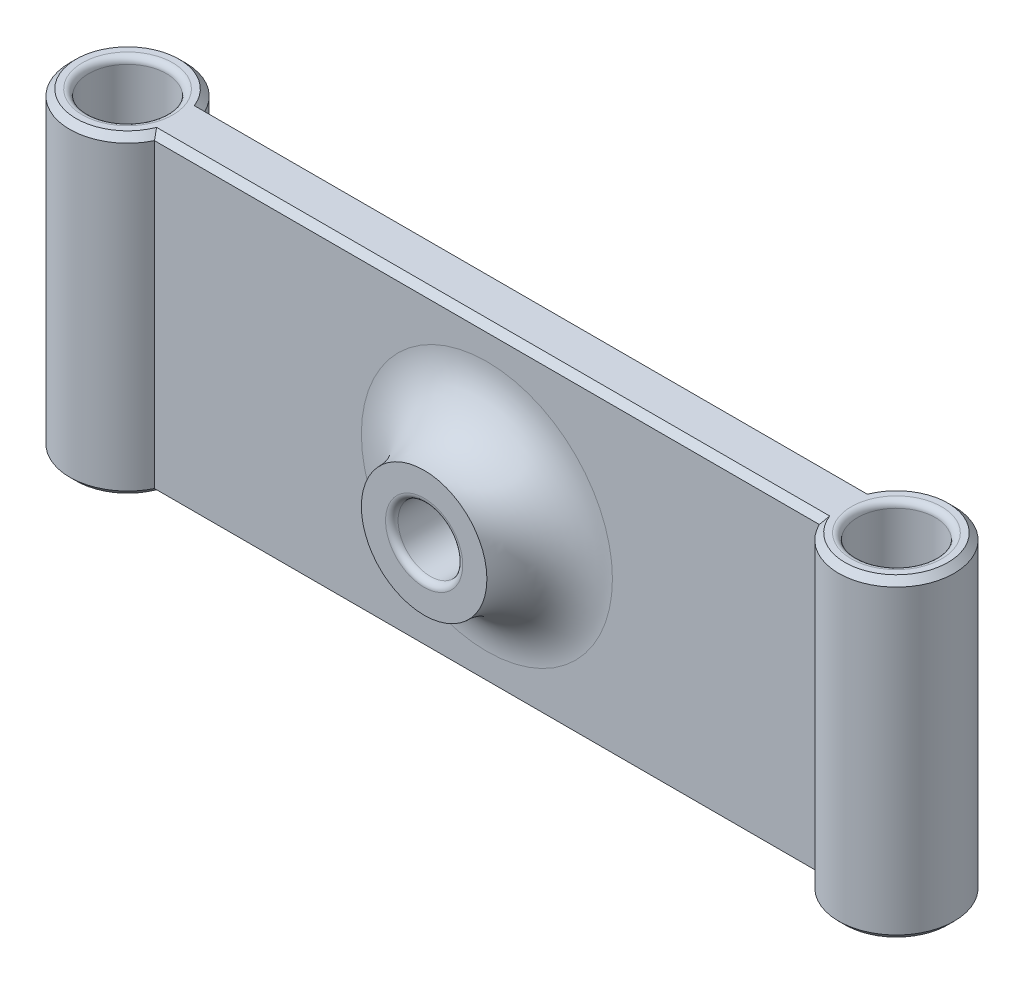
ISO-10303-21;
HEADER;
FILE_DESCRIPTION(('STEP AP214'),'2;1');
FILE_NAME('part.step','',(''),(''),'','','');
FILE_SCHEMA(('AUTOMOTIVE_DESIGN { 1 0 10303 214 1 1 1 1 }'));
ENDSEC;
DATA;
#1=APPLICATION_CONTEXT('core data for automotive mechanical design processes');
#2=APPLICATION_PROTOCOL_DEFINITION('international standard','automotive_design',2000,#1);
#3=PRODUCT_CONTEXT('',#1,'mechanical');
#4=PRODUCT('Part','Part','',(#3));
#5=PRODUCT_RELATED_PRODUCT_CATEGORY('part','',(#4));
#6=PRODUCT_DEFINITION_FORMATION('','',#4);
#7=PRODUCT_DEFINITION_CONTEXT('part definition',#1,'design');
#8=PRODUCT_DEFINITION('design','',#6,#7);
#9=PRODUCT_DEFINITION_SHAPE('','',#8);
#10=(LENGTH_UNIT() NAMED_UNIT(*) SI_UNIT(.MILLI.,.METRE.));
#11=(NAMED_UNIT(*) PLANE_ANGLE_UNIT() SI_UNIT($,.RADIAN.));
#12=(NAMED_UNIT(*) SI_UNIT($,.STERADIAN.) SOLID_ANGLE_UNIT());
#13=UNCERTAINTY_MEASURE_WITH_UNIT(LENGTH_MEASURE(1.E-05),#10,'distance_accuracy_value','');
#14=(GEOMETRIC_REPRESENTATION_CONTEXT(3) GLOBAL_UNCERTAINTY_ASSIGNED_CONTEXT((#13)) GLOBAL_UNIT_ASSIGNED_CONTEXT((#10,
#11,#12)) REPRESENTATION_CONTEXT('',''));
#15=CARTESIAN_POINT('',(0.,0.,0.));
#16=DIRECTION('',(0.,0.,1.));
#17=DIRECTION('',(1.,0.,0.));
#18=AXIS2_PLACEMENT_3D('',#15,#16,#17);
#19=CARTESIAN_POINT('',(-61.25,50.,0.));
#20=DIRECTION('',(0.,1.,0.));
#21=DIRECTION('',(0.,0.,1.));
#22=AXIS2_PLACEMENT_3D('',#19,#20,#21);
#23=PLANE('',#22);
#24=CARTESIAN_POINT('',(61.25,50.,0.));
#25=DIRECTION('',(0.,1.,0.));
#26=DIRECTION('',(0.,0.,1.));
#27=AXIS2_PLACEMENT_3D('',#24,#25,#26);
#28=CIRCLE('',#27,8.19999999999995);
#29=CARTESIAN_POINT('',(53.6184863886645,50.,2.99999999999994));
#30=VERTEX_POINT('',#29);
#31=CARTESIAN_POINT('',(53.6184863886645,50.,-2.99999999999994));
#32=VERTEX_POINT('',#31);
#33=EDGE_CURVE('E126',#30,#32,#28,.T.);
#34=ORIENTED_EDGE('',*,*,#33,.T.);
#35=DIRECTION('',(-1.,0.,0.));
#36=VECTOR('',#35,1.);
#37=CARTESIAN_POINT('',(-52.9650739291168,50.,-2.99999999999993));
#38=LINE('',#37,#36);
#39=CARTESIAN_POINT('',(-53.6184863886645,50.,-2.99999999999993));
#40=VERTEX_POINT('',#39);
#41=EDGE_CURVE('E107',#32,#40,#38,.T.);
#42=ORIENTED_EDGE('',*,*,#41,.T.);
#43=CARTESIAN_POINT('',(-61.25,50.,0.));
#44=DIRECTION('',(0.,1.,0.));
#45=DIRECTION('',(0.,0.,1.));
#46=AXIS2_PLACEMENT_3D('',#43,#44,#45);
#47=CIRCLE('',#46,8.19999999999995);
#48=CARTESIAN_POINT('',(-53.6184863886645,50.,2.99999999999996));
#49=VERTEX_POINT('',#48);
#50=EDGE_CURVE('E115',#40,#49,#47,.T.);
#51=ORIENTED_EDGE('',*,*,#50,.T.);
#52=DIRECTION('',(1.,0.,0.));
#53=VECTOR('',#52,1.);
#54=CARTESIAN_POINT('',(52.9650739291168,50.,2.99999999999994));
#55=LINE('',#54,#53);
#56=EDGE_CURVE('E121',#49,#30,#55,.T.);
#57=ORIENTED_EDGE('',*,*,#56,.T.);
#58=EDGE_LOOP('',(#34,#42,#51,#57));
#59=FACE_BOUND('',#58,.T.);
#60=CARTESIAN_POINT('',(61.25,50.,0.));
#61=DIRECTION('',(0.,1.,0.));
#62=DIRECTION('',(0.,0.,1.));
#63=AXIS2_PLACEMENT_3D('',#60,#61,#62);
#64=CIRCLE('',#63,7.2);
#65=CARTESIAN_POINT('',(61.25,50.,7.19999999999998));
#66=VERTEX_POINT('',#65);
#67=EDGE_CURVE('E291',#66,#66,#64,.F.);
#68=ORIENTED_EDGE('',*,*,#67,.T.);
#69=EDGE_LOOP('',(#68));
#70=FACE_BOUND('',#69,.T.);
#71=CARTESIAN_POINT('',(-61.25,50.,0.));
#72=DIRECTION('',(0.,1.,0.));
#73=DIRECTION('',(0.,0.,1.));
#74=AXIS2_PLACEMENT_3D('',#71,#72,#73);
#75=CIRCLE('',#74,7.2);
#76=CARTESIAN_POINT('',(-61.25,50.,7.2));
#77=VERTEX_POINT('',#76);
#78=EDGE_CURVE('E346',#77,#77,#75,.F.);
#79=ORIENTED_EDGE('',*,*,#78,.T.);
#80=EDGE_LOOP('',(#79));
#81=FACE_BOUND('',#80,.T.);
#82=ADVANCED_FACE('F33',(#59,#70,#81),#23,.T.);
#83=CARTESIAN_POINT('',(-61.25,0.,0.));
#84=DIRECTION('',(0.,1.,0.));
#85=DIRECTION('',(0.,0.,1.));
#86=AXIS2_PLACEMENT_3D('',#83,#84,#85);
#87=PLANE('',#86);
#88=CARTESIAN_POINT('',(61.25,0.,0.));
#89=DIRECTION('',(0.,1.,0.));
#90=DIRECTION('',(0.,0.,1.));
#91=AXIS2_PLACEMENT_3D('',#88,#89,#90);
#92=CIRCLE('',#91,8.19999999999995);
#93=CARTESIAN_POINT('',(53.6184863886645,0.,-2.99999999999994));
#94=VERTEX_POINT('',#93);
#95=CARTESIAN_POINT('',(53.6184863886645,0.,2.99999999999994));
#96=VERTEX_POINT('',#95);
#97=EDGE_CURVE('E46',#94,#96,#92,.F.);
#98=ORIENTED_EDGE('',*,*,#97,.T.);
#99=DIRECTION('',(-1.,0.,0.));
#100=VECTOR('',#99,1.);
#101=CARTESIAN_POINT('',(-61.25,0.,2.99999999999996));
#102=LINE('',#101,#100);
#103=CARTESIAN_POINT('',(-53.6184863886645,0.,2.99999999999996));
#104=VERTEX_POINT('',#103);
#105=EDGE_CURVE('E11',#96,#104,#102,.T.);
#106=ORIENTED_EDGE('',*,*,#105,.T.);
#107=CARTESIAN_POINT('',(-61.25,0.,0.));
#108=DIRECTION('',(0.,1.,0.));
#109=DIRECTION('',(0.,0.,1.));
#110=AXIS2_PLACEMENT_3D('',#107,#108,#109);
#111=CIRCLE('',#110,8.19999999999995);
#112=CARTESIAN_POINT('',(-53.6184863886645,0.,-2.99999999999993));
#113=VERTEX_POINT('',#112);
#114=EDGE_CURVE('E148',#104,#113,#111,.F.);
#115=ORIENTED_EDGE('',*,*,#114,.T.);
#116=DIRECTION('',(1.,0.,0.));
#117=VECTOR('',#116,1.);
#118=CARTESIAN_POINT('',(-61.25,0.,-2.99999999999993));
#119=LINE('',#118,#117);
#120=EDGE_CURVE('E57',#113,#94,#119,.T.);
#121=ORIENTED_EDGE('',*,*,#120,.T.);
#122=EDGE_LOOP('',(#98,#106,#115,#121));
#123=FACE_BOUND('',#122,.T.);
#124=CARTESIAN_POINT('',(-61.25,0.,0.));
#125=DIRECTION('',(0.,1.,0.));
#126=DIRECTION('',(0.,0.,1.));
#127=AXIS2_PLACEMENT_3D('',#124,#125,#126);
#128=CIRCLE('',#127,7.2);
#129=CARTESIAN_POINT('',(-61.25,0.,7.2));
#130=VERTEX_POINT('',#129);
#131=EDGE_CURVE('E331',#130,#130,#128,.T.);
#132=ORIENTED_EDGE('',*,*,#131,.T.);
#133=EDGE_LOOP('',(#132));
#134=FACE_BOUND('',#133,.T.);
#135=CARTESIAN_POINT('',(61.25,0.,0.));
#136=DIRECTION('',(0.,1.,0.));
#137=DIRECTION('',(0.,0.,1.));
#138=AXIS2_PLACEMENT_3D('',#135,#136,#137);
#139=CIRCLE('',#138,7.2);
#140=CARTESIAN_POINT('',(61.25,0.,7.19999999999998));
#141=VERTEX_POINT('',#140);
#142=EDGE_CURVE('E328',#141,#141,#139,.T.);
#143=ORIENTED_EDGE('',*,*,#142,.T.);
#144=EDGE_LOOP('',(#143));
#145=FACE_BOUND('',#144,.T.);
#146=ADVANCED_FACE('F220',(#123,#134,#145),#87,.F.);
#147=CARTESIAN_POINT('',(-61.25,50.,0.));
#148=DIRECTION('',(0.,-1.,0.));
#149=DIRECTION('',(0.,0.,-1.));
#150=AXIS2_PLACEMENT_3D('',#147,#148,#149);
#151=CYLINDRICAL_SURFACE('',#150,9.2);
#152=DIRECTION('',(0.,-1.,0.));
#153=VECTOR('',#152,1.);
#154=CARTESIAN_POINT('',(-52.9650739291168,50.,4.));
#155=LINE('',#154,#153);
#156=CARTESIAN_POINT('',(-52.9650739291168,49.,4.));
#157=VERTEX_POINT('',#156);
#158=CARTESIAN_POINT('',(-52.9650739291168,1.00000000000002,4.));
#159=VERTEX_POINT('',#158);
#160=EDGE_CURVE('E314',#157,#159,#155,.T.);
#161=ORIENTED_EDGE('',*,*,#160,.F.);
#162=CARTESIAN_POINT('',(-61.25,49.,0.));
#163=DIRECTION('',(0.,1.,0.));
#164=DIRECTION('',(0.,0.,1.));
#165=AXIS2_PLACEMENT_3D('',#162,#163,#164);
#166=CIRCLE('',#165,9.2);
#167=CARTESIAN_POINT('',(-52.9650739291168,49.,-3.99999999999997));
#168=VERTEX_POINT('',#167);
#169=EDGE_CURVE('E146',#157,#168,#166,.F.);
#170=ORIENTED_EDGE('',*,*,#169,.T.);
#171=DIRECTION('',(0.,-1.,0.));
#172=VECTOR('',#171,1.);
#173=CARTESIAN_POINT('',(-52.9650739291168,50.,-3.99999999999997));
#174=LINE('',#173,#172);
#175=CARTESIAN_POINT('',(-52.9650739291168,1.00000000000002,-3.99999999999997));
#176=VERTEX_POINT('',#175);
#177=EDGE_CURVE('E310',#168,#176,#174,.T.);
#178=ORIENTED_EDGE('',*,*,#177,.T.);
#179=CARTESIAN_POINT('',(-61.25,1.00000000000002,0.));
#180=DIRECTION('',(0.,1.,0.));
#181=DIRECTION('',(0.,0.,1.));
#182=AXIS2_PLACEMENT_3D('',#179,#180,#181);
#183=CIRCLE('',#182,9.2);
#184=EDGE_CURVE('E144',#176,#159,#183,.T.);
#185=ORIENTED_EDGE('',*,*,#184,.T.);
#186=EDGE_LOOP('',(#161,#170,#178,#185));
#187=FACE_BOUND('',#186,.T.);
#188=ADVANCED_FACE('F225',(#187),#151,.T.);
#189=CARTESIAN_POINT('',(-52.9650739291168,50.,4.));
#190=DIRECTION('',(0.,0.,-1.));
#191=DIRECTION('',(-1.,0.,0.));
#192=AXIS2_PLACEMENT_3D('',#189,#190,#191);
#193=PLANE('',#192);
#194=CARTESIAN_POINT('',(0.,25.,3.99999999999999));
#195=DIRECTION('',(0.,0.,-1.));
#196=DIRECTION('',(-1.,0.,0.));
#197=AXIS2_PLACEMENT_3D('',#194,#195,#196);
#198=CIRCLE('',#197,20.);
#199=CARTESIAN_POINT('',(-20.,25.,4.));
#200=VERTEX_POINT('',#199);
#201=EDGE_CURVE('E325',#200,#200,#198,.T.);
#202=ORIENTED_EDGE('',*,*,#201,.T.);
#203=EDGE_LOOP('',(#202));
#204=FACE_BOUND('',#203,.T.);
#205=DIRECTION('',(0.,-1.,0.));
#206=VECTOR('',#205,1.);
#207=CARTESIAN_POINT('',(52.9650739291168,50.,3.99999999999999));
#208=LINE('',#207,#206);
#209=CARTESIAN_POINT('',(52.9650739291168,49.,3.99999999999999));
#210=VERTEX_POINT('',#209);
#211=CARTESIAN_POINT('',(52.9650739291168,1.00000000000002,3.99999999999999));
#212=VERTEX_POINT('',#211);
#213=EDGE_CURVE('E312',#210,#212,#208,.T.);
#214=ORIENTED_EDGE('',*,*,#213,.F.);
#215=DIRECTION('',(-1.,0.,0.));
#216=VECTOR('',#215,1.);
#217=CARTESIAN_POINT('',(-52.9650739291168,49.,4.));
#218=LINE('',#217,#216);
#219=EDGE_CURVE('E142',#210,#157,#218,.T.);
#220=ORIENTED_EDGE('',*,*,#219,.T.);
#221=ORIENTED_EDGE('',*,*,#160,.T.);
#222=DIRECTION('',(1.,0.,0.));
#223=VECTOR('',#222,1.);
#224=CARTESIAN_POINT('',(-52.9650739291168,1.00000000000002,4.));
#225=LINE('',#224,#223);
#226=EDGE_CURVE('E139',#159,#212,#225,.T.);
#227=ORIENTED_EDGE('',*,*,#226,.T.);
#228=EDGE_LOOP('',(#214,#220,#221,#227));
#229=FACE_BOUND('',#228,.T.);
#230=ADVANCED_FACE('F238',(#204,#229),#193,.F.);
#231=CARTESIAN_POINT('',(61.25,50.,0.));
#232=DIRECTION('',(0.,-1.,0.));
#233=DIRECTION('',(0.,0.,-1.));
#234=AXIS2_PLACEMENT_3D('',#231,#232,#233);
#235=CYLINDRICAL_SURFACE('',#234,9.2);
#236=DIRECTION('',(0.,-1.,0.));
#237=VECTOR('',#236,1.);
#238=CARTESIAN_POINT('',(52.9650739291168,50.,-3.99999999999999));
#239=LINE('',#238,#237);
#240=CARTESIAN_POINT('',(52.9650739291168,49.,-3.99999999999999));
#241=VERTEX_POINT('',#240);
#242=CARTESIAN_POINT('',(52.9650739291168,1.00000000000002,-3.99999999999999));
#243=VERTEX_POINT('',#242);
#244=EDGE_CURVE('E307',#241,#243,#239,.T.);
#245=ORIENTED_EDGE('',*,*,#244,.F.);
#246=CARTESIAN_POINT('',(61.25,49.,0.));
#247=DIRECTION('',(0.,1.,0.));
#248=DIRECTION('',(0.,0.,1.));
#249=AXIS2_PLACEMENT_3D('',#246,#247,#248);
#250=CIRCLE('',#249,9.2);
#251=EDGE_CURVE('E137',#241,#210,#250,.F.);
#252=ORIENTED_EDGE('',*,*,#251,.T.);
#253=ORIENTED_EDGE('',*,*,#213,.T.);
#254=CARTESIAN_POINT('',(61.25,1.00000000000002,0.));
#255=DIRECTION('',(0.,1.,0.));
#256=DIRECTION('',(0.,0.,1.));
#257=AXIS2_PLACEMENT_3D('',#254,#255,#256);
#258=CIRCLE('',#257,9.2);
#259=EDGE_CURVE('E135',#212,#243,#258,.T.);
#260=ORIENTED_EDGE('',*,*,#259,.T.);
#261=EDGE_LOOP('',(#245,#252,#253,#260));
#262=FACE_BOUND('',#261,.T.);
#263=ADVANCED_FACE('F234',(#262),#235,.T.);
#264=CARTESIAN_POINT('',(-52.9650739291168,50.,-3.99999999999997));
#265=DIRECTION('',(0.,0.,1.));
#266=DIRECTION('',(1.,0.,0.));
#267=AXIS2_PLACEMENT_3D('',#264,#265,#266);
#268=PLANE('',#267);
#269=CARTESIAN_POINT('',(0.,25.,-3.99999999999998));
#270=DIRECTION('',(0.,0.,1.));
#271=DIRECTION('',(1.,0.,0.));
#272=AXIS2_PLACEMENT_3D('',#269,#270,#271);
#273=CIRCLE('',#272,19.5393920141695);
#274=CARTESIAN_POINT('',(19.5393920141695,25.,-3.99999999999998));
#275=VERTEX_POINT('',#274);
#276=EDGE_CURVE('E322',#275,#275,#273,.T.);
#277=ORIENTED_EDGE('',*,*,#276,.T.);
#278=EDGE_LOOP('',(#277));
#279=FACE_BOUND('',#278,.T.);
#280=ORIENTED_EDGE('',*,*,#177,.F.);
#281=DIRECTION('',(1.,0.,0.));
#282=VECTOR('',#281,1.);
#283=CARTESIAN_POINT('',(52.9650739291168,49.,-3.99999999999999));
#284=LINE('',#283,#282);
#285=EDGE_CURVE('E109',#168,#241,#284,.T.);
#286=ORIENTED_EDGE('',*,*,#285,.T.);
#287=ORIENTED_EDGE('',*,*,#244,.T.);
#288=DIRECTION('',(-1.,0.,0.));
#289=VECTOR('',#288,1.);
#290=CARTESIAN_POINT('',(-52.9650739291168,1.00000000000002,-3.99999999999997));
#291=LINE('',#290,#289);
#292=EDGE_CURVE('E128',#243,#176,#291,.T.);
#293=ORIENTED_EDGE('',*,*,#292,.T.);
#294=EDGE_LOOP('',(#280,#286,#287,#293));
#295=FACE_BOUND('',#294,.T.);
#296=ADVANCED_FACE('F231',(#279,#295),#268,.F.);
#297=CARTESIAN_POINT('',(-61.25,50.,0.));
#298=DIRECTION('',(0.,-1.,0.));
#299=DIRECTION('',(0.,0.,-1.));
#300=AXIS2_PLACEMENT_3D('',#297,#298,#299);
#301=CYLINDRICAL_SURFACE('',#300,6.2);
#302=CARTESIAN_POINT('',(-61.25,1.,0.));
#303=DIRECTION('',(0.,1.,0.));
#304=DIRECTION('',(0.,0.,1.));
#305=AXIS2_PLACEMENT_3D('',#302,#303,#304);
#306=CIRCLE('',#305,6.2);
#307=CARTESIAN_POINT('',(-61.25,1.,6.2));
#308=VERTEX_POINT('',#307);
#309=EDGE_CURVE('E337',#308,#308,#306,.F.);
#310=ORIENTED_EDGE('',*,*,#309,.T.);
#311=EDGE_LOOP('',(#310));
#312=FACE_BOUND('',#311,.T.);
#313=CARTESIAN_POINT('',(-61.25,49.,0.));
#314=DIRECTION('',(0.,1.,0.));
#315=DIRECTION('',(0.,0.,1.));
#316=AXIS2_PLACEMENT_3D('',#313,#314,#315);
#317=CIRCLE('',#316,6.2);
#318=CARTESIAN_POINT('',(-61.25,49.,6.2));
#319=VERTEX_POINT('',#318);
#320=EDGE_CURVE('E334',#319,#319,#317,.T.);
#321=ORIENTED_EDGE('',*,*,#320,.T.);
#322=EDGE_LOOP('',(#321));
#323=FACE_BOUND('',#322,.T.);
#324=ADVANCED_FACE('F228',(#312,#323),#301,.F.);
#325=CARTESIAN_POINT('',(61.25,50.,0.));
#326=DIRECTION('',(0.,-1.,0.));
#327=DIRECTION('',(0.,0.,-1.));
#328=AXIS2_PLACEMENT_3D('',#325,#326,#327);
#329=CYLINDRICAL_SURFACE('',#328,6.2);
#330=CARTESIAN_POINT('',(61.25,1.,0.));
#331=DIRECTION('',(0.,1.,0.));
#332=DIRECTION('',(0.,0.,1.));
#333=AXIS2_PLACEMENT_3D('',#330,#331,#332);
#334=CIRCLE('',#333,6.2);
#335=CARTESIAN_POINT('',(61.25,1.,6.19999999999998));
#336=VERTEX_POINT('',#335);
#337=EDGE_CURVE('E343',#336,#336,#334,.F.);
#338=ORIENTED_EDGE('',*,*,#337,.T.);
#339=EDGE_LOOP('',(#338));
#340=FACE_BOUND('',#339,.T.);
#341=CARTESIAN_POINT('',(61.25,49.,0.));
#342=DIRECTION('',(0.,1.,0.));
#343=DIRECTION('',(0.,0.,1.));
#344=AXIS2_PLACEMENT_3D('',#341,#342,#343);
#345=CIRCLE('',#344,6.2);
#346=CARTESIAN_POINT('',(61.25,49.,6.19999999999998));
#347=VERTEX_POINT('',#346);
#348=EDGE_CURVE('E340',#347,#347,#345,.T.);
#349=ORIENTED_EDGE('',*,*,#348,.T.);
#350=EDGE_LOOP('',(#349));
#351=FACE_BOUND('',#350,.T.);
#352=ADVANCED_FACE('F354',(#340,#351),#329,.F.);
#353=CARTESIAN_POINT('',(0.,25.,-11.));
#354=DIRECTION('',(0.,0.,1.));
#355=DIRECTION('',(1.,0.,0.));
#356=AXIS2_PLACEMENT_3D('',#353,#354,#355);
#357=PLANE('',#356);
#358=CARTESIAN_POINT('',(0.,25.,-11.));
#359=DIRECTION('',(0.,0.,1.));
#360=DIRECTION('',(1.,0.,0.));
#361=AXIS2_PLACEMENT_3D('',#358,#359,#360);
#362=CIRCLE('',#361,6.15);
#363=CARTESIAN_POINT('',(6.15000000000001,25.,-11.));
#364=VERTEX_POINT('',#363);
#365=EDGE_CURVE('E286',#364,#364,#362,.T.);
#366=ORIENTED_EDGE('',*,*,#365,.T.);
#367=EDGE_LOOP('',(#366));
#368=FACE_BOUND('',#367,.T.);
#369=CARTESIAN_POINT('',(0.,25.,-11.));
#370=DIRECTION('',(0.,0.,1.));
#371=DIRECTION('',(1.,0.,0.));
#372=AXIS2_PLACEMENT_3D('',#369,#370,#371);
#373=CIRCLE('',#372,10.);
#374=CARTESIAN_POINT('',(10.,25.,-11.));
#375=VERTEX_POINT('',#374);
#376=EDGE_CURVE('E316',#375,#375,#373,.T.);
#377=ORIENTED_EDGE('',*,*,#376,.F.);
#378=EDGE_LOOP('',(#377));
#379=FACE_BOUND('',#378,.T.);
#380=ADVANCED_FACE('F356',(#368,#379),#357,.F.);
#381=CARTESIAN_POINT('',(0.,25.,-11.));
#382=DIRECTION('',(0.,0.,1.));
#383=DIRECTION('',(1.,0.,0.));
#384=AXIS2_PLACEMENT_3D('',#381,#382,#383);
#385=CYLINDRICAL_SURFACE('',#384,5.15);
#386=CARTESIAN_POINT('',(0.,25.,-10.));
#387=DIRECTION('',(0.,0.,1.));
#388=DIRECTION('',(1.,0.,0.));
#389=AXIS2_PLACEMENT_3D('',#386,#387,#388);
#390=CIRCLE('',#389,5.15);
#391=CARTESIAN_POINT('',(5.15000000000001,25.,-10.));
#392=VERTEX_POINT('',#391);
#393=EDGE_CURVE('E285',#392,#392,#390,.F.);
#394=ORIENTED_EDGE('',*,*,#393,.T.);
#395=EDGE_LOOP('',(#394));
#396=FACE_BOUND('',#395,.T.);
#397=CARTESIAN_POINT('',(0.,25.,13.));
#398=DIRECTION('',(0.,0.,1.));
#399=DIRECTION('',(1.,0.,0.));
#400=AXIS2_PLACEMENT_3D('',#397,#398,#399);
#401=CIRCLE('',#400,5.15);
#402=CARTESIAN_POINT('',(5.15000000000001,25.,13.));
#403=VERTEX_POINT('',#402);
#404=EDGE_CURVE('E283',#403,#403,#401,.T.);
#405=ORIENTED_EDGE('',*,*,#404,.T.);
#406=EDGE_LOOP('',(#405));
#407=FACE_BOUND('',#406,.T.);
#408=ADVANCED_FACE('F362',(#396,#407),#385,.F.);
#409=CARTESIAN_POINT('',(0.,25.,14.));
#410=DIRECTION('',(0.,0.,1.));
#411=DIRECTION('',(1.,0.,0.));
#412=AXIS2_PLACEMENT_3D('',#409,#410,#411);
#413=PLANE('',#412);
#414=CARTESIAN_POINT('',(0.,25.,14.));
#415=DIRECTION('',(0.,0.,1.));
#416=DIRECTION('',(1.,0.,0.));
#417=AXIS2_PLACEMENT_3D('',#414,#415,#416);
#418=CIRCLE('',#417,6.15);
#419=CARTESIAN_POINT('',(6.15000000000001,25.,14.));
#420=VERTEX_POINT('',#419);
#421=EDGE_CURVE('E122',#420,#420,#418,.F.);
#422=ORIENTED_EDGE('',*,*,#421,.T.);
#423=EDGE_LOOP('',(#422));
#424=FACE_BOUND('',#423,.T.);
#425=CARTESIAN_POINT('',(0.,25.,14.));
#426=DIRECTION('',(0.,0.,1.));
#427=DIRECTION('',(1.,0.,0.));
#428=AXIS2_PLACEMENT_3D('',#425,#426,#427);
#429=CIRCLE('',#428,10.);
#430=CARTESIAN_POINT('',(10.,25.,14.));
#431=VERTEX_POINT('',#430);
#432=EDGE_CURVE('E300',#431,#431,#429,.T.);
#433=ORIENTED_EDGE('',*,*,#432,.T.);
#434=EDGE_LOOP('',(#433));
#435=FACE_BOUND('',#434,.T.);
#436=ADVANCED_FACE('F250',(#424,#435),#413,.T.);
#437=CARTESIAN_POINT('',(0.,25.,-14.));
#438=DIRECTION('',(0.,0.,1.));
#439=DIRECTION('',(1.,0.,0.));
#440=AXIS2_PLACEMENT_3D('',#437,#438,#439);
#441=TOROIDAL_SURFACE('',#440,19.5393920141695,10.);
#442=ORIENTED_EDGE('',*,*,#376,.T.);
#443=EDGE_LOOP('',(#442));
#444=FACE_BOUND('',#443,.T.);
#445=ORIENTED_EDGE('',*,*,#276,.F.);
#446=EDGE_LOOP('',(#445));
#447=FACE_BOUND('',#446,.T.);
#448=ADVANCED_FACE('F246',(#444,#447),#441,.F.);
#449=CARTESIAN_POINT('',(0.,25.,14.));
#450=DIRECTION('',(0.,0.,-1.));
#451=DIRECTION('',(-1.,0.,0.));
#452=AXIS2_PLACEMENT_3D('',#449,#450,#451);
#453=TOROIDAL_SURFACE('',#452,20.,10.);
#454=ORIENTED_EDGE('',*,*,#432,.F.);
#455=EDGE_LOOP('',(#454));
#456=FACE_BOUND('',#455,.T.);
#457=ORIENTED_EDGE('',*,*,#201,.F.);
#458=EDGE_LOOP('',(#457));
#459=FACE_BOUND('',#458,.T.);
#460=ADVANCED_FACE('F249',(#456,#459),#453,.F.);
#461=CARTESIAN_POINT('',(-61.25,1.,0.));
#462=DIRECTION('',(0.,1.,0.));
#463=DIRECTION('',(0.,0.,1.));
#464=AXIS2_PLACEMENT_3D('',#461,#462,#463);
#465=TOROIDAL_SURFACE('',#464,7.2,1.);
#466=ORIENTED_EDGE('',*,*,#309,.F.);
#467=EDGE_LOOP('',(#466));
#468=FACE_BOUND('',#467,.T.);
#469=ORIENTED_EDGE('',*,*,#131,.F.);
#470=EDGE_LOOP('',(#469));
#471=FACE_BOUND('',#470,.T.);
#472=ADVANCED_FACE('F254',(#468,#471),#465,.T.);
#473=CARTESIAN_POINT('',(61.25,1.,0.));
#474=DIRECTION('',(0.,1.,0.));
#475=DIRECTION('',(0.,0.,1.));
#476=AXIS2_PLACEMENT_3D('',#473,#474,#475);
#477=TOROIDAL_SURFACE('',#476,7.2,1.);
#478=ORIENTED_EDGE('',*,*,#337,.F.);
#479=EDGE_LOOP('',(#478));
#480=FACE_BOUND('',#479,.T.);
#481=ORIENTED_EDGE('',*,*,#142,.F.);
#482=EDGE_LOOP('',(#481));
#483=FACE_BOUND('',#482,.T.);
#484=ADVANCED_FACE('F258',(#480,#483),#477,.T.);
#485=CARTESIAN_POINT('',(61.25,49.,0.));
#486=DIRECTION('',(0.,1.,0.));
#487=DIRECTION('',(0.,0.,1.));
#488=AXIS2_PLACEMENT_3D('',#485,#486,#487);
#489=TOROIDAL_SURFACE('',#488,7.2,1.);
#490=ORIENTED_EDGE('',*,*,#67,.F.);
#491=EDGE_LOOP('',(#490));
#492=FACE_BOUND('',#491,.T.);
#493=ORIENTED_EDGE('',*,*,#348,.F.);
#494=EDGE_LOOP('',(#493));
#495=FACE_BOUND('',#494,.T.);
#496=ADVANCED_FACE('F262',(#492,#495),#489,.T.);
#497=CARTESIAN_POINT('',(-61.25,49.,0.));
#498=DIRECTION('',(0.,1.,0.));
#499=DIRECTION('',(0.,0.,1.));
#500=AXIS2_PLACEMENT_3D('',#497,#498,#499);
#501=TOROIDAL_SURFACE('',#500,7.2,1.);
#502=ORIENTED_EDGE('',*,*,#78,.F.);
#503=EDGE_LOOP('',(#502));
#504=FACE_BOUND('',#503,.T.);
#505=ORIENTED_EDGE('',*,*,#320,.F.);
#506=EDGE_LOOP('',(#505));
#507=FACE_BOUND('',#506,.T.);
#508=ADVANCED_FACE('F266',(#504,#507),#501,.T.);
#509=CARTESIAN_POINT('',(0.,25.,-10.));
#510=DIRECTION('',(0.,0.,1.));
#511=DIRECTION('',(1.,0.,0.));
#512=AXIS2_PLACEMENT_3D('',#509,#510,#511);
#513=TOROIDAL_SURFACE('',#512,6.15,1.);
#514=ORIENTED_EDGE('',*,*,#393,.F.);
#515=EDGE_LOOP('',(#514));
#516=FACE_BOUND('',#515,.T.);
#517=ORIENTED_EDGE('',*,*,#365,.F.);
#518=EDGE_LOOP('',(#517));
#519=FACE_BOUND('',#518,.T.);
#520=ADVANCED_FACE('F270',(#516,#519),#513,.T.);
#521=CARTESIAN_POINT('',(0.,25.,13.));
#522=DIRECTION('',(0.,0.,1.));
#523=DIRECTION('',(1.,0.,0.));
#524=AXIS2_PLACEMENT_3D('',#521,#522,#523);
#525=TOROIDAL_SURFACE('',#524,6.15,1.);
#526=ORIENTED_EDGE('',*,*,#421,.F.);
#527=EDGE_LOOP('',(#526));
#528=FACE_BOUND('',#527,.T.);
#529=ORIENTED_EDGE('',*,*,#404,.F.);
#530=EDGE_LOOP('',(#529));
#531=FACE_BOUND('',#530,.T.);
#532=ADVANCED_FACE('F183',(#528,#531),#525,.T.);
#533=CARTESIAN_POINT('',(-61.25,50.,2.99999999999996));
#534=DIRECTION('',(0.,0.70710678118655,0.707106781186545));
#535=DIRECTION('',(-1.,0.,0.));
#536=AXIS2_PLACEMENT_3D('',#533,#534,#535);
#537=PLANE('',#536);
#538=CARTESIAN_POINT('',(-52.9650739291168,49.,4.));
#539=CARTESIAN_POINT('',(-53.0177410907724,49.083911178017,3.916088821983));
#540=CARTESIAN_POINT('',(-53.0708268679788,49.1676912625406,3.83230873745937));
#541=CARTESIAN_POINT('',(-53.1778733665847,49.3349652731878,3.66503472681214));
#542=CARTESIAN_POINT('',(-53.2318340343604,49.4184592164725,3.58154078352747));
#543=CARTESIAN_POINT('',(-53.3406749154781,49.5851479396348,3.41485206036519));
#544=CARTESIAN_POINT('',(-53.3955551366961,49.6683427169426,3.33165728305733));
#545=CARTESIAN_POINT('',(-53.5062838578292,49.8344156127034,3.16558438729659));
#546=CARTESIAN_POINT('',(-53.5621324166758,49.9172937115065,3.08270628849349));
#547=CARTESIAN_POINT('',(-53.6184863886645,50.,2.99999999999996));
#548=B_SPLINE_CURVE_WITH_KNOTS('',3,(#538,#539,#540,#541,#542,#543,#544,#545,#546,#547),
.UNSPECIFIED.,.F.,.F.,(4,2,2,2,4),(0.,0.389491705087169,0.778959626959718,1.16843088630171,
1.55792593204008),.UNSPECIFIED.);
#549=EDGE_CURVE('E118',#157,#49,#548,.T.);
#550=ORIENTED_EDGE('',*,*,#549,.F.);
#551=ORIENTED_EDGE('',*,*,#219,.F.);
#552=CARTESIAN_POINT('',(52.9650739291168,49.,3.99999999999999));
#553=CARTESIAN_POINT('',(53.0177410907724,49.083911178017,3.91608882198299));
#554=CARTESIAN_POINT('',(53.0708268679788,49.1676912625406,3.83230873745936));
#555=CARTESIAN_POINT('',(53.1778733665847,49.3349652731878,3.66503472681213));
#556=CARTESIAN_POINT('',(53.2318340343604,49.4184592164725,3.58154078352745));
#557=CARTESIAN_POINT('',(53.3406749154782,49.5851479396348,3.41485206036517));
#558=CARTESIAN_POINT('',(53.3955551366961,49.6683427169426,3.33165728305732));
#559=CARTESIAN_POINT('',(53.5062838578292,49.8344156127034,3.16558438729657));
#560=CARTESIAN_POINT('',(53.5621324166758,49.9172937115065,3.08270628849347));
#561=CARTESIAN_POINT('',(53.6184863886645,50.,2.99999999999994));
#562=B_SPLINE_CURVE_WITH_KNOTS('',3,(#552,#553,#554,#555,#556,#557,#558,#559,#560,#561),
.UNSPECIFIED.,.F.,.F.,(4,2,2,2,4),(0.,0.389491705087177,0.77895962695972,1.16843088630171,
1.55792593204009),.UNSPECIFIED.);
#563=EDGE_CURVE('E174',#30,#210,#562,.F.);
#564=ORIENTED_EDGE('',*,*,#563,.F.);
#565=ORIENTED_EDGE('',*,*,#56,.F.);
#566=EDGE_LOOP('',(#550,#551,#564,#565));
#567=FACE_BOUND('',#566,.T.);
#568=ADVANCED_FACE('F179',(#567),#537,.T.);
#569=CARTESIAN_POINT('',(61.25,50.,0.));
#570=DIRECTION('',(0.,-1.,0.));
#571=DIRECTION('',(0.,0.,-1.));
#572=AXIS2_PLACEMENT_3D('',#569,#570,#571);
#573=CONICAL_SURFACE('',#572,8.19999999999995,0.785398163397453);
#574=ORIENTED_EDGE('',*,*,#563,.T.);
#575=ORIENTED_EDGE('',*,*,#251,.F.);
#576=CARTESIAN_POINT('',(52.9650739291168,49.,-3.99999999999999));
#577=CARTESIAN_POINT('',(53.0177410907724,49.083911178017,-3.91608882198299));
#578=CARTESIAN_POINT('',(53.0708268679788,49.1676912625406,-3.83230873745936));
#579=CARTESIAN_POINT('',(53.1778733665847,49.3349652731878,-3.66503472681213));
#580=CARTESIAN_POINT('',(53.2318340343604,49.4184592164725,-3.58154078352745));
#581=CARTESIAN_POINT('',(53.3406749154781,49.5851479396348,-3.41485206036517));
#582=CARTESIAN_POINT('',(53.3955551366961,49.6683427169426,-3.33165728305732));
#583=CARTESIAN_POINT('',(53.5062838578292,49.8344156127034,-3.16558438729657));
#584=CARTESIAN_POINT('',(53.5621324166758,49.9172937115065,-3.08270628849348));
#585=CARTESIAN_POINT('',(53.6184863886645,50.,-2.99999999999994));
#586=B_SPLINE_CURVE_WITH_KNOTS('',3,(#576,#577,#578,#579,#580,#581,#582,#583,#584,#585),
.UNSPECIFIED.,.F.,.F.,(4,2,2,2,4),(0.,0.389491705087173,0.778959626959715,1.16843088630171,
1.55792593204009),.UNSPECIFIED.);
#587=EDGE_CURVE('E112',#32,#241,#586,.F.);
#588=ORIENTED_EDGE('',*,*,#587,.F.);
#589=ORIENTED_EDGE('',*,*,#33,.F.);
#590=EDGE_LOOP('',(#574,#575,#588,#589));
#591=FACE_BOUND('',#590,.T.);
#592=ADVANCED_FACE('F166',(#591),#573,.T.);
#593=CARTESIAN_POINT('',(-61.25,50.,0.));
#594=DIRECTION('',(0.,-1.,0.));
#595=DIRECTION('',(0.,0.,-1.));
#596=AXIS2_PLACEMENT_3D('',#593,#594,#595);
#597=CONICAL_SURFACE('',#596,8.19999999999995,0.785398163397453);
#598=ORIENTED_EDGE('',*,*,#549,.T.);
#599=ORIENTED_EDGE('',*,*,#50,.F.);
#600=CARTESIAN_POINT('',(-53.6184863886645,50.,-2.99999999999993));
#601=CARTESIAN_POINT('',(-53.5621324166758,49.9172937115065,-3.08270628849346));
#602=CARTESIAN_POINT('',(-53.5062838578292,49.8344156127034,-3.16558438729656));
#603=CARTESIAN_POINT('',(-53.3955551366961,49.6683427169426,-3.33165728305731));
#604=CARTESIAN_POINT('',(-53.3406749154781,49.5851479396348,-3.41485206036516));
#605=CARTESIAN_POINT('',(-53.2318340343604,49.4184592164725,-3.58154078352744));
#606=CARTESIAN_POINT('',(-53.1778733665847,49.3349652731878,-3.66503472681211));
#607=CARTESIAN_POINT('',(-53.0708268679788,49.1676912625406,-3.83230873745934));
#608=CARTESIAN_POINT('',(-53.0177410907724,49.083911178017,-3.91608882198298));
#609=CARTESIAN_POINT('',(-52.9650739291168,49.,-3.99999999999997));
#610=B_SPLINE_CURVE_WITH_KNOTS('',3,(#600,#601,#602,#603,#604,#605,#606,#607,#608,#609),
.UNSPECIFIED.,.F.,.F.,(4,2,2,2,4),(0.,0.389495045738376,0.778966305080364,1.16843422695291,
1.55792593204008),.UNSPECIFIED.);
#611=EDGE_CURVE('E103',#168,#40,#610,.F.);
#612=ORIENTED_EDGE('',*,*,#611,.F.);
#613=ORIENTED_EDGE('',*,*,#169,.F.);
#614=EDGE_LOOP('',(#598,#599,#612,#613));
#615=FACE_BOUND('',#614,.T.);
#616=ADVANCED_FACE('F116',(#615),#597,.T.);
#617=CARTESIAN_POINT('',(-61.25,50.,-2.99999999999993));
#618=DIRECTION('',(0.,0.70710678118655,-0.707106781186545));
#619=DIRECTION('',(1.,0.,0.));
#620=AXIS2_PLACEMENT_3D('',#617,#618,#619);
#621=PLANE('',#620);
#622=ORIENTED_EDGE('',*,*,#587,.T.);
#623=ORIENTED_EDGE('',*,*,#285,.F.);
#624=ORIENTED_EDGE('',*,*,#611,.T.);
#625=ORIENTED_EDGE('',*,*,#41,.F.);
#626=EDGE_LOOP('',(#622,#623,#624,#625));
#627=FACE_BOUND('',#626,.T.);
#628=ADVANCED_FACE('F105',(#627),#621,.T.);
#629=CARTESIAN_POINT('',(-52.9650739291168,1.00000000000002,-3.99999999999997));
#630=DIRECTION('',(0.,0.707106781186555,0.70710678118654));
#631=DIRECTION('',(-1.,0.,0.));
#632=AXIS2_PLACEMENT_3D('',#629,#630,#631);
#633=PLANE('',#632);
#634=CARTESIAN_POINT('',(52.9650739291168,1.00000000000002,-3.99999999999999));
#635=CARTESIAN_POINT('',(53.0177410907724,0.916088821983026,-3.91608882198299));
#636=CARTESIAN_POINT('',(53.0708268679788,0.832308737459394,-3.83230873745936));
#637=CARTESIAN_POINT('',(53.1778733665847,0.665034726812166,-3.66503472681213));
#638=CARTESIAN_POINT('',(53.2318340343604,0.581540783527496,-3.58154078352745));
#639=CARTESIAN_POINT('',(53.3406749154781,0.414852060365221,-3.41485206036517));
#640=CARTESIAN_POINT('',(53.3955551366961,0.331657283057371,-3.33165728305732));
#641=CARTESIAN_POINT('',(53.5062838578292,0.165584387296625,-3.16558438729657));
#642=CARTESIAN_POINT('',(53.5621324166758,0.0827062884935292,-3.08270628849348));
#643=CARTESIAN_POINT('',(53.6184863886645,0.,-2.99999999999994));
#644=B_SPLINE_CURVE_WITH_KNOTS('',3,(#634,#635,#636,#637,#638,#639,#640,#641,#642,#643),
.UNSPECIFIED.,.F.,.F.,(4,2,2,2,4),(0.,0.389491705087172,0.778959626959712,1.1684308863017,
1.55792593204008),.UNSPECIFIED.);
#645=EDGE_CURVE('E203',#94,#243,#644,.F.);
#646=ORIENTED_EDGE('',*,*,#645,.F.);
#647=ORIENTED_EDGE('',*,*,#120,.F.);
#648=CARTESIAN_POINT('',(-52.9650739291168,1.00000000000002,-3.99999999999998));
#649=CARTESIAN_POINT('',(-53.0177410907724,0.916088821983027,-3.91608882198298));
#650=CARTESIAN_POINT('',(-53.0708268679788,0.832308737459394,-3.83230873745934));
#651=CARTESIAN_POINT('',(-53.1778733665847,0.665034726812166,-3.66503472681211));
#652=CARTESIAN_POINT('',(-53.2318340343604,0.581540783527496,-3.58154078352744));
#653=CARTESIAN_POINT('',(-53.3406749154781,0.414852060365222,-3.41485206036516));
#654=CARTESIAN_POINT('',(-53.3955551366961,0.331657283057372,-3.33165728305731));
#655=CARTESIAN_POINT('',(-53.5062838578292,0.165584387296627,-3.16558438729656));
#656=CARTESIAN_POINT('',(-53.5621324166758,0.0827062884935305,-3.08270628849346));
#657=CARTESIAN_POINT('',(-53.6184863886645,0.,-2.99999999999993));
#658=B_SPLINE_CURVE_WITH_KNOTS('',3,(#648,#649,#650,#651,#652,#653,#654,#655,#656,#657),
.UNSPECIFIED.,.F.,.F.,(4,2,2,2,4),(0.,0.389491705087173,0.778959626959712,1.16843088630169,
1.55792593204008),.UNSPECIFIED.);
#659=EDGE_CURVE('E38',#176,#113,#658,.T.);
#660=ORIENTED_EDGE('',*,*,#659,.F.);
#661=ORIENTED_EDGE('',*,*,#292,.F.);
#662=EDGE_LOOP('',(#646,#647,#660,#661));
#663=FACE_BOUND('',#662,.T.);
#664=ADVANCED_FACE('F35',(#663),#633,.F.);
#665=CARTESIAN_POINT('',(-61.25,1.00000000000002,0.));
#666=DIRECTION('',(0.,1.,0.));
#667=DIRECTION('',(0.,0.,1.));
#668=AXIS2_PLACEMENT_3D('',#665,#666,#667);
#669=CONICAL_SURFACE('',#668,9.2,0.78539816339746);
#670=ORIENTED_EDGE('',*,*,#659,.T.);
#671=ORIENTED_EDGE('',*,*,#114,.F.);
#672=CARTESIAN_POINT('',(-53.6184863886645,0.,2.99999999999996));
#673=CARTESIAN_POINT('',(-53.5621324166758,0.0827062884935296,3.08270628849349));
#674=CARTESIAN_POINT('',(-53.5062838578292,0.165584387296625,3.16558438729659));
#675=CARTESIAN_POINT('',(-53.3955551366961,0.331657283057371,3.33165728305734));
#676=CARTESIAN_POINT('',(-53.3406749154781,0.414852060365222,3.41485206036519));
#677=CARTESIAN_POINT('',(-53.2318340343604,0.581540783527498,3.58154078352747));
#678=CARTESIAN_POINT('',(-53.1778733665847,0.665034726812168,3.66503472681214));
#679=CARTESIAN_POINT('',(-53.0708268679788,0.832308737459396,3.83230873745937));
#680=CARTESIAN_POINT('',(-53.0177410907724,0.916088821983028,3.916088821983));
#681=CARTESIAN_POINT('',(-52.9650739291168,1.00000000000002,4.));
#682=B_SPLINE_CURVE_WITH_KNOTS('',3,(#672,#673,#674,#675,#676,#677,#678,#679,#680,#681),
.UNSPECIFIED.,.F.,.F.,(4,2,2,2,4),(0.,0.389495045738379,0.778966305080366,1.16843422695291,
1.55792593204008),.UNSPECIFIED.);
#683=EDGE_CURVE('E199',#159,#104,#682,.F.);
#684=ORIENTED_EDGE('',*,*,#683,.F.);
#685=ORIENTED_EDGE('',*,*,#184,.F.);
#686=EDGE_LOOP('',(#670,#671,#684,#685));
#687=FACE_BOUND('',#686,.T.);
#688=ADVANCED_FACE('F207',(#687),#669,.T.);
#689=CARTESIAN_POINT('',(61.25,1.00000000000002,0.));
#690=DIRECTION('',(0.,1.,0.));
#691=DIRECTION('',(0.,0.,1.));
#692=AXIS2_PLACEMENT_3D('',#689,#690,#691);
#693=CONICAL_SURFACE('',#692,9.2,0.78539816339746);
#694=ORIENTED_EDGE('',*,*,#645,.T.);
#695=ORIENTED_EDGE('',*,*,#259,.F.);
#696=CARTESIAN_POINT('',(52.9650739291168,1.00000000000002,3.99999999999999));
#697=CARTESIAN_POINT('',(53.0177410907724,0.916088821983028,3.91608882198299));
#698=CARTESIAN_POINT('',(53.0708268679788,0.832308737459395,3.83230873745936));
#699=CARTESIAN_POINT('',(53.1778733665847,0.665034726812168,3.66503472681213));
#700=CARTESIAN_POINT('',(53.2318340343604,0.581540783527497,3.58154078352745));
#701=CARTESIAN_POINT('',(53.3406749154782,0.414852060365223,3.41485206036518));
#702=CARTESIAN_POINT('',(53.3955551366961,0.331657283057373,3.33165728305732));
#703=CARTESIAN_POINT('',(53.5062838578292,0.165584387296627,3.16558438729657));
#704=CARTESIAN_POINT('',(53.5621324166758,0.0827062884935304,3.08270628849348));
#705=CARTESIAN_POINT('',(53.6184863886645,0.,2.99999999999994));
#706=B_SPLINE_CURVE_WITH_KNOTS('',3,(#696,#697,#698,#699,#700,#701,#702,#703,#704,#705),
.UNSPECIFIED.,.F.,.F.,(4,2,2,2,4),(0.,0.38949170508717,0.778959626959711,1.16843088630169,
1.55792593204008),.UNSPECIFIED.);
#707=EDGE_CURVE('E194',#96,#212,#706,.F.);
#708=ORIENTED_EDGE('',*,*,#707,.F.);
#709=ORIENTED_EDGE('',*,*,#97,.F.);
#710=EDGE_LOOP('',(#694,#695,#708,#709));
#711=FACE_BOUND('',#710,.T.);
#712=ADVANCED_FACE('F190',(#711),#693,.T.);
#713=CARTESIAN_POINT('',(-52.9650739291168,1.00000000000002,4.));
#714=DIRECTION('',(0.,0.707106781186555,-0.70710678118654));
#715=DIRECTION('',(1.,0.,0.));
#716=AXIS2_PLACEMENT_3D('',#713,#714,#715);
#717=PLANE('',#716);
#718=ORIENTED_EDGE('',*,*,#683,.T.);
#719=ORIENTED_EDGE('',*,*,#105,.F.);
#720=ORIENTED_EDGE('',*,*,#707,.T.);
#721=ORIENTED_EDGE('',*,*,#226,.F.);
#722=EDGE_LOOP('',(#718,#719,#720,#721));
#723=FACE_BOUND('',#722,.T.);
#724=ADVANCED_FACE('F185',(#723),#717,.F.);
#725=CLOSED_SHELL('',(#82,#146,#188,#230,#263,#296,#324,#352,#380,#408,#436,#448,#460,#472,#484,
#496,#508,#520,#532,#568,#592,#616,#628,#664,#688,#712,#724));
#726=MANIFOLD_SOLID_BREP('B2',#725);
#727=ADVANCED_BREP_SHAPE_REPRESENTATION('',(#18,#726),#14);
#728=SHAPE_DEFINITION_REPRESENTATION(#9,#727);
ENDSEC;
END-ISO-10303-21;
